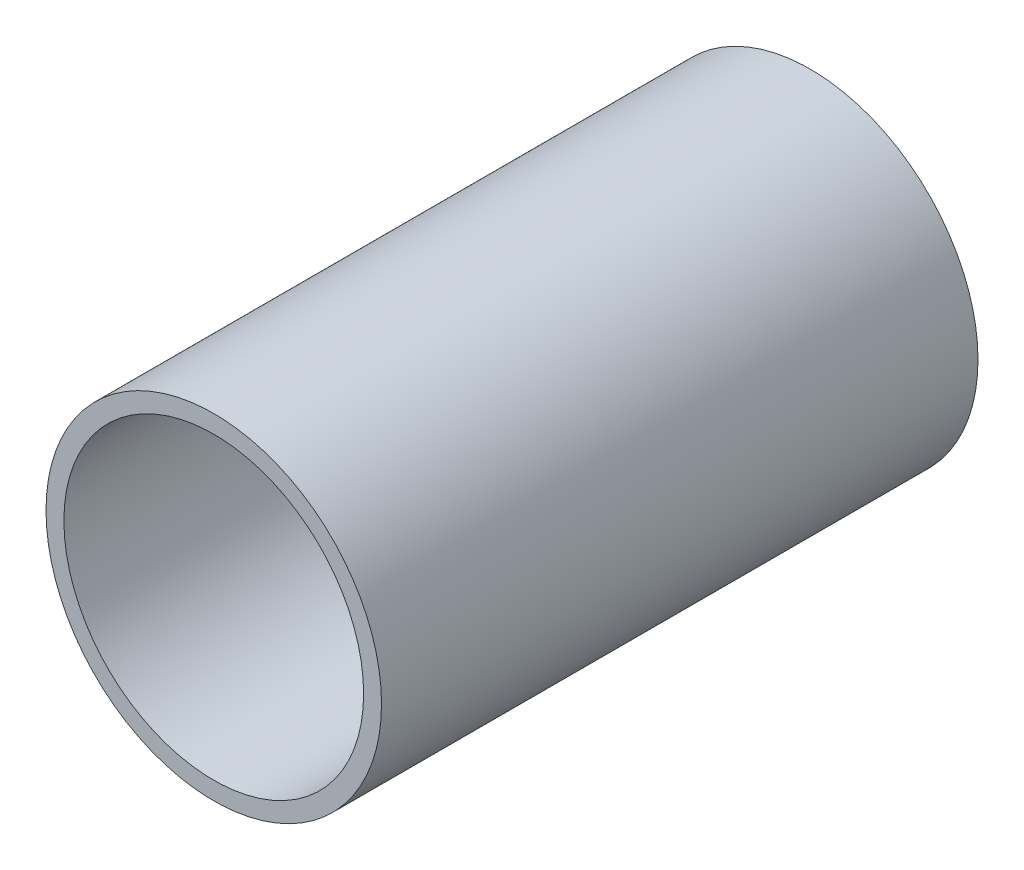
ISO-10303-21;
HEADER;
FILE_DESCRIPTION(('STEP AP214'),'2;1');
FILE_NAME('part.step','',(''),(''),'','','');
FILE_SCHEMA(('AUTOMOTIVE_DESIGN { 1 0 10303 214 1 1 1 1 }'));
ENDSEC;
DATA;
#1=APPLICATION_CONTEXT('core data for automotive mechanical design processes');
#2=APPLICATION_PROTOCOL_DEFINITION('international standard','automotive_design',2000,#1);
#3=PRODUCT_CONTEXT('',#1,'mechanical');
#4=PRODUCT('Part','Part','',(#3));
#5=PRODUCT_RELATED_PRODUCT_CATEGORY('part','',(#4));
#6=PRODUCT_DEFINITION_FORMATION('','',#4);
#7=PRODUCT_DEFINITION_CONTEXT('part definition',#1,'design');
#8=PRODUCT_DEFINITION('design','',#6,#7);
#9=PRODUCT_DEFINITION_SHAPE('','',#8);
#10=(LENGTH_UNIT() NAMED_UNIT(*) SI_UNIT(.MILLI.,.METRE.));
#11=(NAMED_UNIT(*) PLANE_ANGLE_UNIT() SI_UNIT($,.RADIAN.));
#12=(NAMED_UNIT(*) SI_UNIT($,.STERADIAN.) SOLID_ANGLE_UNIT());
#13=UNCERTAINTY_MEASURE_WITH_UNIT(LENGTH_MEASURE(1.E-05),#10,'distance_accuracy_value','');
#14=(GEOMETRIC_REPRESENTATION_CONTEXT(3) GLOBAL_UNCERTAINTY_ASSIGNED_CONTEXT((#13)) GLOBAL_UNIT_ASSIGNED_CONTEXT((#10,
#11,#12)) REPRESENTATION_CONTEXT('',''));
#15=CARTESIAN_POINT('',(0.,0.,0.));
#16=DIRECTION('',(0.,0.,1.));
#17=DIRECTION('',(1.,0.,0.));
#18=AXIS2_PLACEMENT_3D('',#15,#16,#17);
#19=CARTESIAN_POINT('',(0.,0.,50.8));
#20=DIRECTION('',(0.,0.,1.));
#21=DIRECTION('',(1.,0.,0.));
#22=AXIS2_PLACEMENT_3D('',#19,#20,#21);
#23=PLANE('',#22);
#24=CARTESIAN_POINT('',(0.,0.,50.8));
#25=DIRECTION('',(0.,0.,1.));
#26=DIRECTION('',(1.,0.,0.));
#27=AXIS2_PLACEMENT_3D('',#24,#25,#26);
#28=CIRCLE('',#27,28.575);
#29=CARTESIAN_POINT('',(28.575,0.,50.8));
#30=VERTEX_POINT('',#29);
#31=EDGE_CURVE('E10',#30,#30,#28,.T.);
#32=ORIENTED_EDGE('',*,*,#31,.T.);
#33=EDGE_LOOP('',(#32));
#34=FACE_BOUND('',#33,.T.);
#35=CARTESIAN_POINT('',(0.,0.,50.8));
#36=DIRECTION('',(0.,0.,1.));
#37=DIRECTION('',(1.,0.,0.));
#38=AXIS2_PLACEMENT_3D('',#35,#36,#37);
#39=CIRCLE('',#38,25.527);
#40=CARTESIAN_POINT('',(25.527,0.,50.8));
#41=VERTEX_POINT('',#40);
#42=EDGE_CURVE('E48',#41,#41,#39,.T.);
#43=ORIENTED_EDGE('',*,*,#42,.F.);
#44=EDGE_LOOP('',(#43));
#45=FACE_BOUND('',#44,.T.);
#46=ADVANCED_FACE('F37',(#34,#45),#23,.T.);
#47=CARTESIAN_POINT('',(0.,0.,-50.8));
#48=DIRECTION('',(0.,0.,1.));
#49=DIRECTION('',(1.,0.,0.));
#50=AXIS2_PLACEMENT_3D('',#47,#48,#49);
#51=PLANE('',#50);
#52=CARTESIAN_POINT('',(0.,0.,-50.8));
#53=DIRECTION('',(0.,0.,1.));
#54=DIRECTION('',(1.,0.,0.));
#55=AXIS2_PLACEMENT_3D('',#52,#53,#54);
#56=CIRCLE('',#55,28.575);
#57=CARTESIAN_POINT('',(28.575,0.,-50.8));
#58=VERTEX_POINT('',#57);
#59=EDGE_CURVE('E41',#58,#58,#56,.T.);
#60=ORIENTED_EDGE('',*,*,#59,.F.);
#61=EDGE_LOOP('',(#60));
#62=FACE_BOUND('',#61,.T.);
#63=CARTESIAN_POINT('',(0.,0.,-50.8));
#64=DIRECTION('',(0.,0.,1.));
#65=DIRECTION('',(1.,0.,0.));
#66=AXIS2_PLACEMENT_3D('',#63,#64,#65);
#67=CIRCLE('',#66,25.527);
#68=CARTESIAN_POINT('',(25.527,0.,-50.8));
#69=VERTEX_POINT('',#68);
#70=EDGE_CURVE('E50',#69,#69,#67,.T.);
#71=ORIENTED_EDGE('',*,*,#70,.T.);
#72=EDGE_LOOP('',(#71));
#73=FACE_BOUND('',#72,.T.);
#74=ADVANCED_FACE('F60',(#62,#73),#51,.F.);
#75=CARTESIAN_POINT('',(0.,0.,50.8));
#76=DIRECTION('',(0.,0.,-1.));
#77=DIRECTION('',(-1.,0.,0.));
#78=AXIS2_PLACEMENT_3D('',#75,#76,#77);
#79=CYLINDRICAL_SURFACE('',#78,28.575);
#80=ORIENTED_EDGE('',*,*,#31,.F.);
#81=EDGE_LOOP('',(#80));
#82=FACE_BOUND('',#81,.T.);
#83=ORIENTED_EDGE('',*,*,#59,.T.);
#84=EDGE_LOOP('',(#83));
#85=FACE_BOUND('',#84,.T.);
#86=ADVANCED_FACE('F39',(#82,#85),#79,.T.);
#87=CARTESIAN_POINT('',(0.,0.,50.8));
#88=DIRECTION('',(0.,0.,-1.));
#89=DIRECTION('',(-1.,0.,0.));
#90=AXIS2_PLACEMENT_3D('',#87,#88,#89);
#91=CYLINDRICAL_SURFACE('',#90,25.527);
#92=ORIENTED_EDGE('',*,*,#42,.T.);
#93=EDGE_LOOP('',(#92));
#94=FACE_BOUND('',#93,.T.);
#95=ORIENTED_EDGE('',*,*,#70,.F.);
#96=EDGE_LOOP('',(#95));
#97=FACE_BOUND('',#96,.T.);
#98=ADVANCED_FACE('F56',(#94,#97),#91,.F.);
#99=CLOSED_SHELL('',(#46,#74,#86,#98));
#100=MANIFOLD_SOLID_BREP('B2',#99);
#101=ADVANCED_BREP_SHAPE_REPRESENTATION('',(#18,#100),#14);
#102=SHAPE_DEFINITION_REPRESENTATION(#9,#101);
ENDSEC;
END-ISO-10303-21;
